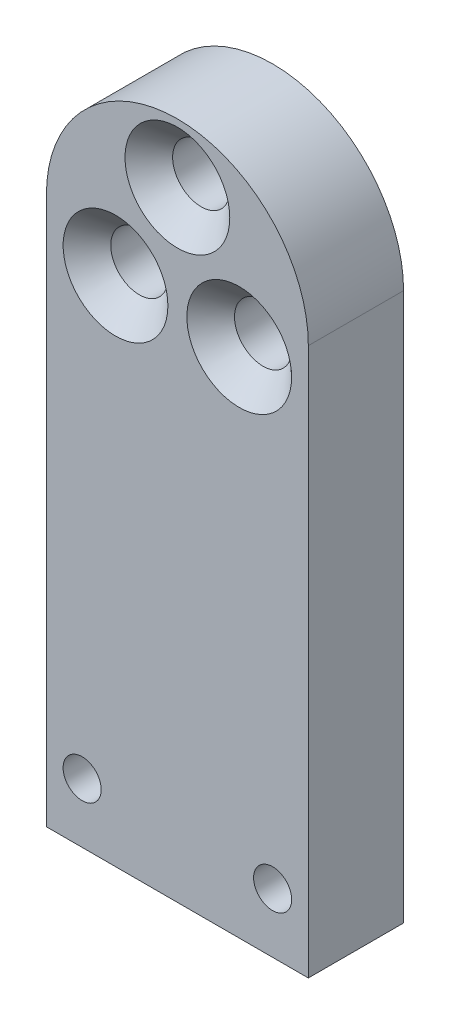
ISO-10303-21;
HEADER;
FILE_DESCRIPTION(('STEP AP214'),'2;1');
FILE_NAME('part.step','',(''),(''),'','','');
FILE_SCHEMA(('AUTOMOTIVE_DESIGN { 1 0 10303 214 1 1 1 1 }'));
ENDSEC;
DATA;
#1=APPLICATION_CONTEXT('core data for automotive mechanical design processes');
#2=APPLICATION_PROTOCOL_DEFINITION('international standard','automotive_design',2000,#1);
#3=PRODUCT_CONTEXT('',#1,'mechanical');
#4=PRODUCT('Part','Part','',(#3));
#5=PRODUCT_RELATED_PRODUCT_CATEGORY('part','',(#4));
#6=PRODUCT_DEFINITION_FORMATION('','',#4);
#7=PRODUCT_DEFINITION_CONTEXT('part definition',#1,'design');
#8=PRODUCT_DEFINITION('design','',#6,#7);
#9=PRODUCT_DEFINITION_SHAPE('','',#8);
#10=(LENGTH_UNIT() NAMED_UNIT(*) SI_UNIT(.MILLI.,.METRE.));
#11=(NAMED_UNIT(*) PLANE_ANGLE_UNIT() SI_UNIT($,.RADIAN.));
#12=(NAMED_UNIT(*) SI_UNIT($,.STERADIAN.) SOLID_ANGLE_UNIT());
#13=UNCERTAINTY_MEASURE_WITH_UNIT(LENGTH_MEASURE(1.E-05),#10,'distance_accuracy_value','');
#14=(GEOMETRIC_REPRESENTATION_CONTEXT(3) GLOBAL_UNCERTAINTY_ASSIGNED_CONTEXT((#13)) GLOBAL_UNIT_ASSIGNED_CONTEXT((#10,
#11,#12)) REPRESENTATION_CONTEXT('',''));
#15=CARTESIAN_POINT('',(0.,0.,0.));
#16=DIRECTION('',(0.,0.,1.));
#17=DIRECTION('',(1.,0.,0.));
#18=AXIS2_PLACEMENT_3D('',#15,#16,#17);
#19=CARTESIAN_POINT('',(0.,0.,4.));
#20=DIRECTION('',(0.,0.,-1.));
#21=DIRECTION('',(-1.,0.,0.));
#22=AXIS2_PLACEMENT_3D('',#19,#20,#21);
#23=CYLINDRICAL_SURFACE('',#22,5.5);
#24=CARTESIAN_POINT('',(0.,0.,0.));
#25=DIRECTION('',(0.,0.,1.));
#26=DIRECTION('',(1.,0.,0.));
#27=AXIS2_PLACEMENT_3D('',#24,#25,#26);
#28=CIRCLE('',#27,5.5);
#29=CARTESIAN_POINT('',(5.5,0.,0.));
#30=VERTEX_POINT('',#29);
#31=CARTESIAN_POINT('',(-5.5,0.,0.));
#32=VERTEX_POINT('',#31);
#33=EDGE_CURVE('E104',#30,#32,#28,.T.);
#34=ORIENTED_EDGE('',*,*,#33,.T.);
#35=DIRECTION('',(0.,0.,-1.));
#36=VECTOR('',#35,1.);
#37=CARTESIAN_POINT('',(-5.5,0.,4.));
#38=LINE('',#37,#36);
#39=CARTESIAN_POINT('',(-5.5,0.,4.));
#40=VERTEX_POINT('',#39);
#41=EDGE_CURVE('E11',#40,#32,#38,.T.);
#42=ORIENTED_EDGE('',*,*,#41,.F.);
#43=CARTESIAN_POINT('',(0.,0.,4.));
#44=DIRECTION('',(0.,0.,1.));
#45=DIRECTION('',(1.,0.,0.));
#46=AXIS2_PLACEMENT_3D('',#43,#44,#45);
#47=CIRCLE('',#46,5.5);
#48=CARTESIAN_POINT('',(5.5,0.,4.));
#49=VERTEX_POINT('',#48);
#50=EDGE_CURVE('E92',#49,#40,#47,.T.);
#51=ORIENTED_EDGE('',*,*,#50,.F.);
#52=DIRECTION('',(0.,0.,-1.));
#53=VECTOR('',#52,1.);
#54=CARTESIAN_POINT('',(5.5,0.,4.));
#55=LINE('',#54,#53);
#56=EDGE_CURVE('E100',#49,#30,#55,.T.);
#57=ORIENTED_EDGE('',*,*,#56,.T.);
#58=EDGE_LOOP('',(#34,#42,#51,#57));
#59=FACE_BOUND('',#58,.T.);
#60=ADVANCED_FACE('F41',(#59),#23,.T.);
#61=CARTESIAN_POINT('',(-5.5,0.,4.));
#62=DIRECTION('',(1.,0.,0.));
#63=DIRECTION('',(0.,1.,0.));
#64=AXIS2_PLACEMENT_3D('',#61,#62,#63);
#65=PLANE('',#64);
#66=DIRECTION('',(0.,-1.,0.));
#67=VECTOR('',#66,1.);
#68=CARTESIAN_POINT('',(-5.5,0.,0.));
#69=LINE('',#68,#67);
#70=CARTESIAN_POINT('',(-5.5,-23.,0.));
#71=VERTEX_POINT('',#70);
#72=EDGE_CURVE('E96',#32,#71,#69,.T.);
#73=ORIENTED_EDGE('',*,*,#72,.T.);
#74=DIRECTION('',(0.,0.,-1.));
#75=VECTOR('',#74,1.);
#76=CARTESIAN_POINT('',(-5.5,-23.,4.));
#77=LINE('',#76,#75);
#78=CARTESIAN_POINT('',(-5.5,-23.,4.));
#79=VERTEX_POINT('',#78);
#80=EDGE_CURVE('E49',#79,#71,#77,.T.);
#81=ORIENTED_EDGE('',*,*,#80,.F.);
#82=DIRECTION('',(0.,-1.,0.));
#83=VECTOR('',#82,1.);
#84=CARTESIAN_POINT('',(-5.5,0.,4.));
#85=LINE('',#84,#83);
#86=EDGE_CURVE('E87',#40,#79,#85,.T.);
#87=ORIENTED_EDGE('',*,*,#86,.F.);
#88=ORIENTED_EDGE('',*,*,#41,.T.);
#89=EDGE_LOOP('',(#73,#81,#87,#88));
#90=FACE_BOUND('',#89,.T.);
#91=ADVANCED_FACE('F95',(#90),#65,.F.);
#92=CARTESIAN_POINT('',(5.5,-23.,4.));
#93=DIRECTION('',(0.,1.,0.));
#94=DIRECTION('',(0.,0.,1.));
#95=AXIS2_PLACEMENT_3D('',#92,#93,#94);
#96=PLANE('',#95);
#97=DIRECTION('',(1.,0.,0.));
#98=VECTOR('',#97,1.);
#99=CARTESIAN_POINT('',(5.5,-23.,0.));
#100=LINE('',#99,#98);
#101=CARTESIAN_POINT('',(5.5,-23.,0.));
#102=VERTEX_POINT('',#101);
#103=EDGE_CURVE('E74',#71,#102,#100,.T.);
#104=ORIENTED_EDGE('',*,*,#103,.T.);
#105=DIRECTION('',(0.,0.,-1.));
#106=VECTOR('',#105,1.);
#107=CARTESIAN_POINT('',(5.5,-23.,4.));
#108=LINE('',#107,#106);
#109=CARTESIAN_POINT('',(5.5,-23.,4.));
#110=VERTEX_POINT('',#109);
#111=EDGE_CURVE('E97',#110,#102,#108,.T.);
#112=ORIENTED_EDGE('',*,*,#111,.F.);
#113=DIRECTION('',(1.,0.,0.));
#114=VECTOR('',#113,1.);
#115=CARTESIAN_POINT('',(5.5,-23.,4.));
#116=LINE('',#115,#114);
#117=EDGE_CURVE('E90',#79,#110,#116,.T.);
#118=ORIENTED_EDGE('',*,*,#117,.F.);
#119=ORIENTED_EDGE('',*,*,#80,.T.);
#120=EDGE_LOOP('',(#104,#112,#118,#119));
#121=FACE_BOUND('',#120,.T.);
#122=ADVANCED_FACE('F98',(#121),#96,.F.);
#123=CARTESIAN_POINT('',(5.5,0.,4.));
#124=DIRECTION('',(-1.,0.,0.));
#125=DIRECTION('',(0.,-1.,0.));
#126=AXIS2_PLACEMENT_3D('',#123,#124,#125);
#127=PLANE('',#126);
#128=DIRECTION('',(0.,1.,0.));
#129=VECTOR('',#128,1.);
#130=CARTESIAN_POINT('',(5.5,0.,0.));
#131=LINE('',#130,#129);
#132=EDGE_CURVE('E80',#102,#30,#131,.T.);
#133=ORIENTED_EDGE('',*,*,#132,.T.);
#134=ORIENTED_EDGE('',*,*,#56,.F.);
#135=DIRECTION('',(0.,1.,0.));
#136=VECTOR('',#135,1.);
#137=CARTESIAN_POINT('',(5.5,0.,4.));
#138=LINE('',#137,#136);
#139=EDGE_CURVE('E57',#110,#49,#138,.T.);
#140=ORIENTED_EDGE('',*,*,#139,.F.);
#141=ORIENTED_EDGE('',*,*,#111,.T.);
#142=EDGE_LOOP('',(#133,#134,#140,#141));
#143=FACE_BOUND('',#142,.T.);
#144=ADVANCED_FACE('F112',(#143),#127,.F.);
#145=CARTESIAN_POINT('',(0.,0.,4.));
#146=DIRECTION('',(0.,0.,1.));
#147=DIRECTION('',(1.,0.,0.));
#148=AXIS2_PLACEMENT_3D('',#145,#146,#147);
#149=PLANE('',#148);
#150=CARTESIAN_POINT('',(2.59807621135333,-1.49999999999998,4.));
#151=DIRECTION('',(0.,0.,1.));
#152=DIRECTION('',(1.,0.,0.));
#153=AXIS2_PLACEMENT_3D('',#150,#151,#152);
#154=CIRCLE('',#153,2.2);
#155=CARTESIAN_POINT('',(4.79807621135333,-1.49999999999998,4.));
#156=VERTEX_POINT('',#155);
#157=EDGE_CURVE('E153',#156,#156,#154,.T.);
#158=ORIENTED_EDGE('',*,*,#157,.F.);
#159=EDGE_LOOP('',(#158));
#160=FACE_BOUND('',#159,.T.);
#161=CARTESIAN_POINT('',(-2.59807621135331,-1.50000000000001,4.));
#162=DIRECTION('',(0.,0.,1.));
#163=DIRECTION('',(1.,0.,0.));
#164=AXIS2_PLACEMENT_3D('',#161,#162,#163);
#165=CIRCLE('',#164,2.2);
#166=CARTESIAN_POINT('',(-0.398076211353309,-1.50000000000001,4.));
#167=VERTEX_POINT('',#166);
#168=EDGE_CURVE('E144',#167,#167,#165,.T.);
#169=ORIENTED_EDGE('',*,*,#168,.F.);
#170=EDGE_LOOP('',(#169));
#171=FACE_BOUND('',#170,.T.);
#172=CARTESIAN_POINT('',(0.,3.,4.));
#173=DIRECTION('',(0.,0.,1.));
#174=DIRECTION('',(1.,0.,0.));
#175=AXIS2_PLACEMENT_3D('',#172,#173,#174);
#176=CIRCLE('',#175,2.2);
#177=CARTESIAN_POINT('',(2.2,3.,4.));
#178=VERTEX_POINT('',#177);
#179=EDGE_CURVE('E135',#178,#178,#176,.T.);
#180=ORIENTED_EDGE('',*,*,#179,.F.);
#181=EDGE_LOOP('',(#180));
#182=FACE_BOUND('',#181,.T.);
#183=CARTESIAN_POINT('',(-4.,-20.5,4.));
#184=DIRECTION('',(0.,0.,1.));
#185=DIRECTION('',(1.,0.,0.));
#186=AXIS2_PLACEMENT_3D('',#183,#184,#185);
#187=CIRCLE('',#186,0.799999999999999);
#188=CARTESIAN_POINT('',(-3.2,-20.5,4.));
#189=VERTEX_POINT('',#188);
#190=EDGE_CURVE('E126',#189,#189,#187,.T.);
#191=ORIENTED_EDGE('',*,*,#190,.F.);
#192=EDGE_LOOP('',(#191));
#193=FACE_BOUND('',#192,.T.);
#194=CARTESIAN_POINT('',(4.,-20.5,4.));
#195=DIRECTION('',(0.,0.,1.));
#196=DIRECTION('',(1.,0.,0.));
#197=AXIS2_PLACEMENT_3D('',#194,#195,#196);
#198=CIRCLE('',#197,0.799999999999999);
#199=CARTESIAN_POINT('',(4.8,-20.5,4.));
#200=VERTEX_POINT('',#199);
#201=EDGE_CURVE('E120',#200,#200,#198,.T.);
#202=ORIENTED_EDGE('',*,*,#201,.F.);
#203=EDGE_LOOP('',(#202));
#204=FACE_BOUND('',#203,.T.);
#205=ORIENTED_EDGE('',*,*,#50,.T.);
#206=ORIENTED_EDGE('',*,*,#86,.T.);
#207=ORIENTED_EDGE('',*,*,#117,.T.);
#208=ORIENTED_EDGE('',*,*,#139,.T.);
#209=EDGE_LOOP('',(#205,#206,#207,#208));
#210=FACE_BOUND('',#209,.T.);
#211=ADVANCED_FACE('F88',(#160,#171,#182,#193,#204,#210),#149,.T.);
#212=CARTESIAN_POINT('',(0.,0.,0.));
#213=DIRECTION('',(0.,0.,1.));
#214=DIRECTION('',(1.,0.,0.));
#215=AXIS2_PLACEMENT_3D('',#212,#213,#214);
#216=PLANE('',#215);
#217=CARTESIAN_POINT('',(2.59807621135333,-1.49999999999998,0.));
#218=DIRECTION('',(0.,0.,1.));
#219=DIRECTION('',(1.,0.,0.));
#220=AXIS2_PLACEMENT_3D('',#217,#218,#219);
#221=CIRCLE('',#220,1.2);
#222=CARTESIAN_POINT('',(3.79807621135333,-1.49999999999998,0.));
#223=VERTEX_POINT('',#222);
#224=EDGE_CURVE('E147',#223,#223,#221,.T.);
#225=ORIENTED_EDGE('',*,*,#224,.T.);
#226=EDGE_LOOP('',(#225));
#227=FACE_BOUND('',#226,.T.);
#228=CARTESIAN_POINT('',(-2.59807621135331,-1.50000000000001,0.));
#229=DIRECTION('',(0.,0.,1.));
#230=DIRECTION('',(1.,0.,0.));
#231=AXIS2_PLACEMENT_3D('',#228,#229,#230);
#232=CIRCLE('',#231,1.2);
#233=CARTESIAN_POINT('',(-1.39807621135331,-1.50000000000001,0.));
#234=VERTEX_POINT('',#233);
#235=EDGE_CURVE('E138',#234,#234,#232,.T.);
#236=ORIENTED_EDGE('',*,*,#235,.T.);
#237=EDGE_LOOP('',(#236));
#238=FACE_BOUND('',#237,.T.);
#239=CARTESIAN_POINT('',(0.,3.,0.));
#240=DIRECTION('',(0.,0.,1.));
#241=DIRECTION('',(1.,0.,0.));
#242=AXIS2_PLACEMENT_3D('',#239,#240,#241);
#243=CIRCLE('',#242,1.2);
#244=CARTESIAN_POINT('',(1.2,3.,0.));
#245=VERTEX_POINT('',#244);
#246=EDGE_CURVE('E129',#245,#245,#243,.T.);
#247=ORIENTED_EDGE('',*,*,#246,.T.);
#248=EDGE_LOOP('',(#247));
#249=FACE_BOUND('',#248,.T.);
#250=CARTESIAN_POINT('',(-4.,-20.5,0.));
#251=DIRECTION('',(0.,0.,1.));
#252=DIRECTION('',(1.,0.,0.));
#253=AXIS2_PLACEMENT_3D('',#250,#251,#252);
#254=CIRCLE('',#253,0.799999999999999);
#255=CARTESIAN_POINT('',(-3.2,-20.5,0.));
#256=VERTEX_POINT('',#255);
#257=EDGE_CURVE('E123',#256,#256,#254,.T.);
#258=ORIENTED_EDGE('',*,*,#257,.T.);
#259=EDGE_LOOP('',(#258));
#260=FACE_BOUND('',#259,.T.);
#261=CARTESIAN_POINT('',(4.,-20.5,0.));
#262=DIRECTION('',(0.,0.,1.));
#263=DIRECTION('',(1.,0.,0.));
#264=AXIS2_PLACEMENT_3D('',#261,#262,#263);
#265=CIRCLE('',#264,0.799999999999999);
#266=CARTESIAN_POINT('',(4.8,-20.5,0.));
#267=VERTEX_POINT('',#266);
#268=EDGE_CURVE('E107',#267,#267,#265,.T.);
#269=ORIENTED_EDGE('',*,*,#268,.T.);
#270=EDGE_LOOP('',(#269));
#271=FACE_BOUND('',#270,.T.);
#272=ORIENTED_EDGE('',*,*,#33,.F.);
#273=ORIENTED_EDGE('',*,*,#132,.F.);
#274=ORIENTED_EDGE('',*,*,#103,.F.);
#275=ORIENTED_EDGE('',*,*,#72,.F.);
#276=EDGE_LOOP('',(#272,#273,#274,#275));
#277=FACE_BOUND('',#276,.T.);
#278=ADVANCED_FACE('F115',(#227,#238,#249,#260,#271,#277),#216,.F.);
#279=CARTESIAN_POINT('',(4.,-20.5,4.));
#280=DIRECTION('',(0.,0.,1.));
#281=DIRECTION('',(1.,0.,0.));
#282=AXIS2_PLACEMENT_3D('',#279,#280,#281);
#283=CYLINDRICAL_SURFACE('',#282,0.799999999999999);
#284=ORIENTED_EDGE('',*,*,#268,.F.);
#285=EDGE_LOOP('',(#284));
#286=FACE_BOUND('',#285,.T.);
#287=ORIENTED_EDGE('',*,*,#201,.T.);
#288=EDGE_LOOP('',(#287));
#289=FACE_BOUND('',#288,.T.);
#290=ADVANCED_FACE('F170',(#286,#289),#283,.F.);
#291=CARTESIAN_POINT('',(-4.,-20.5,4.));
#292=DIRECTION('',(0.,0.,1.));
#293=DIRECTION('',(1.,0.,0.));
#294=AXIS2_PLACEMENT_3D('',#291,#292,#293);
#295=CYLINDRICAL_SURFACE('',#294,0.799999999999999);
#296=ORIENTED_EDGE('',*,*,#257,.F.);
#297=EDGE_LOOP('',(#296));
#298=FACE_BOUND('',#297,.T.);
#299=ORIENTED_EDGE('',*,*,#190,.T.);
#300=EDGE_LOOP('',(#299));
#301=FACE_BOUND('',#300,.T.);
#302=ADVANCED_FACE('F172',(#298,#301),#295,.F.);
#303=CARTESIAN_POINT('',(0.,3.,4.));
#304=DIRECTION('',(0.,0.,1.));
#305=DIRECTION('',(1.,0.,0.));
#306=AXIS2_PLACEMENT_3D('',#303,#304,#305);
#307=CYLINDRICAL_SURFACE('',#306,1.2);
#308=ORIENTED_EDGE('',*,*,#246,.F.);
#309=EDGE_LOOP('',(#308));
#310=FACE_BOUND('',#309,.T.);
#311=CARTESIAN_POINT('',(0.,3.,3.));
#312=DIRECTION('',(0.,0.,1.));
#313=DIRECTION('',(1.,0.,0.));
#314=AXIS2_PLACEMENT_3D('',#311,#312,#313);
#315=CIRCLE('',#314,1.2);
#316=CARTESIAN_POINT('',(1.2,3.,3.));
#317=VERTEX_POINT('',#316);
#318=EDGE_CURVE('E132',#317,#317,#315,.T.);
#319=ORIENTED_EDGE('',*,*,#318,.T.);
#320=EDGE_LOOP('',(#319));
#321=FACE_BOUND('',#320,.T.);
#322=ADVANCED_FACE('F179',(#310,#321),#307,.F.);
#323=CARTESIAN_POINT('',(0.,3.,4.));
#324=DIRECTION('',(0.,0.,1.));
#325=DIRECTION('',(1.,0.,0.));
#326=AXIS2_PLACEMENT_3D('',#323,#324,#325);
#327=CONICAL_SURFACE('',#326,2.2,0.785398163397449);
#328=ORIENTED_EDGE('',*,*,#318,.F.);
#329=EDGE_LOOP('',(#328));
#330=FACE_BOUND('',#329,.T.);
#331=ORIENTED_EDGE('',*,*,#179,.T.);
#332=EDGE_LOOP('',(#331));
#333=FACE_BOUND('',#332,.T.);
#334=ADVANCED_FACE('F223',(#330,#333),#327,.F.);
#335=CARTESIAN_POINT('',(-2.59807621135331,-1.50000000000001,4.));
#336=DIRECTION('',(0.,0.,1.));
#337=DIRECTION('',(1.,0.,0.));
#338=AXIS2_PLACEMENT_3D('',#335,#336,#337);
#339=CYLINDRICAL_SURFACE('',#338,1.2);
#340=ORIENTED_EDGE('',*,*,#235,.F.);
#341=EDGE_LOOP('',(#340));
#342=FACE_BOUND('',#341,.T.);
#343=CARTESIAN_POINT('',(-2.59807621135331,-1.50000000000001,3.));
#344=DIRECTION('',(0.,0.,1.));
#345=DIRECTION('',(1.,0.,0.));
#346=AXIS2_PLACEMENT_3D('',#343,#344,#345);
#347=CIRCLE('',#346,1.2);
#348=CARTESIAN_POINT('',(-1.39807621135331,-1.50000000000001,3.));
#349=VERTEX_POINT('',#348);
#350=EDGE_CURVE('E141',#349,#349,#347,.T.);
#351=ORIENTED_EDGE('',*,*,#350,.T.);
#352=EDGE_LOOP('',(#351));
#353=FACE_BOUND('',#352,.T.);
#354=ADVANCED_FACE('F217',(#342,#353),#339,.F.);
#355=CARTESIAN_POINT('',(-2.59807621135331,-1.50000000000001,4.));
#356=DIRECTION('',(0.,0.,1.));
#357=DIRECTION('',(1.,0.,0.));
#358=AXIS2_PLACEMENT_3D('',#355,#356,#357);
#359=CONICAL_SURFACE('',#358,2.2,0.785398163397449);
#360=ORIENTED_EDGE('',*,*,#350,.F.);
#361=EDGE_LOOP('',(#360));
#362=FACE_BOUND('',#361,.T.);
#363=ORIENTED_EDGE('',*,*,#168,.T.);
#364=EDGE_LOOP('',(#363));
#365=FACE_BOUND('',#364,.T.);
#366=ADVANCED_FACE('F222',(#362,#365),#359,.F.);
#367=CARTESIAN_POINT('',(2.59807621135333,-1.49999999999998,4.));
#368=DIRECTION('',(0.,0.,1.));
#369=DIRECTION('',(1.,0.,0.));
#370=AXIS2_PLACEMENT_3D('',#367,#368,#369);
#371=CYLINDRICAL_SURFACE('',#370,1.2);
#372=ORIENTED_EDGE('',*,*,#224,.F.);
#373=EDGE_LOOP('',(#372));
#374=FACE_BOUND('',#373,.T.);
#375=CARTESIAN_POINT('',(2.59807621135333,-1.49999999999998,3.));
#376=DIRECTION('',(0.,0.,1.));
#377=DIRECTION('',(1.,0.,0.));
#378=AXIS2_PLACEMENT_3D('',#375,#376,#377);
#379=CIRCLE('',#378,1.2);
#380=CARTESIAN_POINT('',(3.79807621135333,-1.49999999999998,3.));
#381=VERTEX_POINT('',#380);
#382=EDGE_CURVE('E150',#381,#381,#379,.T.);
#383=ORIENTED_EDGE('',*,*,#382,.T.);
#384=EDGE_LOOP('',(#383));
#385=FACE_BOUND('',#384,.T.);
#386=ADVANCED_FACE('F236',(#374,#385),#371,.F.);
#387=CARTESIAN_POINT('',(2.59807621135333,-1.49999999999998,4.));
#388=DIRECTION('',(0.,0.,1.));
#389=DIRECTION('',(1.,0.,0.));
#390=AXIS2_PLACEMENT_3D('',#387,#388,#389);
#391=CONICAL_SURFACE('',#390,2.2,0.785398163397449);
#392=ORIENTED_EDGE('',*,*,#382,.F.);
#393=EDGE_LOOP('',(#392));
#394=FACE_BOUND('',#393,.T.);
#395=ORIENTED_EDGE('',*,*,#157,.T.);
#396=EDGE_LOOP('',(#395));
#397=FACE_BOUND('',#396,.T.);
#398=ADVANCED_FACE('F157',(#394,#397),#391,.F.);
#399=CLOSED_SHELL('',(#60,#91,#122,#144,#211,#278,#290,#302,#322,#334,#354,#366,#386,#398));
#400=MANIFOLD_SOLID_BREP('B2',#399);
#401=ADVANCED_BREP_SHAPE_REPRESENTATION('',(#18,#400),#14);
#402=SHAPE_DEFINITION_REPRESENTATION(#9,#401);
ENDSEC;
END-ISO-10303-21;
